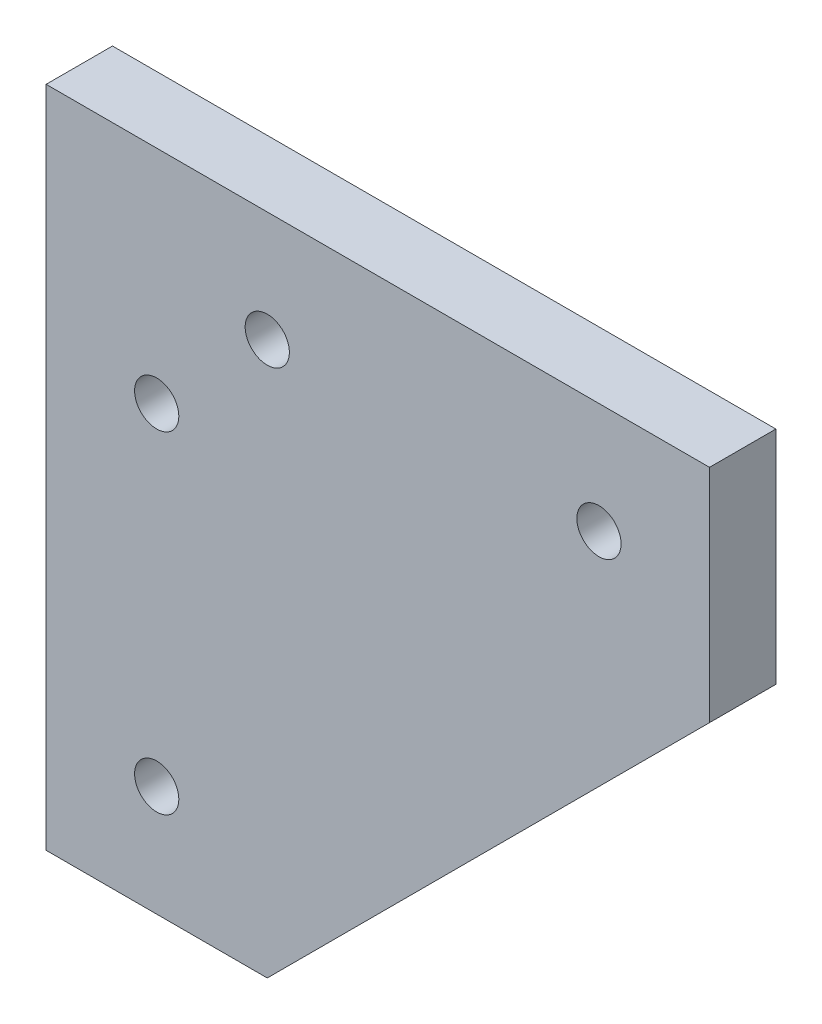
ISO-10303-21;
HEADER;
FILE_DESCRIPTION(('STEP AP214'),'2;1');
FILE_NAME('part.step','',(''),(''),'','','');
FILE_SCHEMA(('AUTOMOTIVE_DESIGN { 1 0 10303 214 1 1 1 1 }'));
ENDSEC;
DATA;
#1=APPLICATION_CONTEXT('core data for automotive mechanical design processes');
#2=APPLICATION_PROTOCOL_DEFINITION('international standard','automotive_design',2000,#1);
#3=PRODUCT_CONTEXT('',#1,'mechanical');
#4=PRODUCT('Part','Part','',(#3));
#5=PRODUCT_RELATED_PRODUCT_CATEGORY('part','',(#4));
#6=PRODUCT_DEFINITION_FORMATION('','',#4);
#7=PRODUCT_DEFINITION_CONTEXT('part definition',#1,'design');
#8=PRODUCT_DEFINITION('design','',#6,#7);
#9=PRODUCT_DEFINITION_SHAPE('','',#8);
#10=(LENGTH_UNIT() NAMED_UNIT(*) SI_UNIT(.MILLI.,.METRE.));
#11=(NAMED_UNIT(*) PLANE_ANGLE_UNIT() SI_UNIT($,.RADIAN.));
#12=(NAMED_UNIT(*) SI_UNIT($,.STERADIAN.) SOLID_ANGLE_UNIT());
#13=UNCERTAINTY_MEASURE_WITH_UNIT(LENGTH_MEASURE(1.E-05),#10,'distance_accuracy_value','');
#14=(GEOMETRIC_REPRESENTATION_CONTEXT(3) GLOBAL_UNCERTAINTY_ASSIGNED_CONTEXT((#13)) GLOBAL_UNIT_ASSIGNED_CONTEXT((#10,
#11,#12)) REPRESENTATION_CONTEXT('',''));
#15=CARTESIAN_POINT('',(0.,0.,0.));
#16=DIRECTION('',(0.,0.,1.));
#17=DIRECTION('',(1.,0.,0.));
#18=AXIS2_PLACEMENT_3D('',#15,#16,#17);
#19=CARTESIAN_POINT('',(0.,0.,6.));
#20=DIRECTION('',(0.,0.,1.));
#21=DIRECTION('',(1.,0.,0.));
#22=AXIS2_PLACEMENT_3D('',#19,#20,#21);
#23=PLANE('',#22);
#24=CARTESIAN_POINT('',(10.,-50.,6.));
#25=DIRECTION('',(0.,0.,1.));
#26=DIRECTION('',(1.,0.,0.));
#27=AXIS2_PLACEMENT_3D('',#24,#25,#26);
#28=CIRCLE('',#27,2.);
#29=CARTESIAN_POINT('',(12.,-50.,6.));
#30=VERTEX_POINT('',#29);
#31=EDGE_CURVE('E172',#30,#30,#28,.T.);
#32=ORIENTED_EDGE('',*,*,#31,.F.);
#33=EDGE_LOOP('',(#32));
#34=FACE_BOUND('',#33,.T.);
#35=CARTESIAN_POINT('',(50.,-10.,6.));
#36=DIRECTION('',(0.,0.,1.));
#37=DIRECTION('',(1.,0.,0.));
#38=AXIS2_PLACEMENT_3D('',#35,#36,#37);
#39=CIRCLE('',#38,2.);
#40=CARTESIAN_POINT('',(52.,-10.,6.));
#41=VERTEX_POINT('',#40);
#42=EDGE_CURVE('E112',#41,#41,#39,.T.);
#43=ORIENTED_EDGE('',*,*,#42,.F.);
#44=EDGE_LOOP('',(#43));
#45=FACE_BOUND('',#44,.T.);
#46=DIRECTION('',(0.,-1.,0.));
#47=VECTOR('',#46,1.);
#48=CARTESIAN_POINT('',(0.,0.,6.));
#49=LINE('',#48,#47);
#50=CARTESIAN_POINT('',(0.,0.,6.));
#51=VERTEX_POINT('',#50);
#52=CARTESIAN_POINT('',(0.,-60.,6.));
#53=VERTEX_POINT('',#52);
#54=EDGE_CURVE('E117',#51,#53,#49,.T.);
#55=ORIENTED_EDGE('',*,*,#54,.T.);
#56=DIRECTION('',(1.,0.,0.));
#57=VECTOR('',#56,1.);
#58=CARTESIAN_POINT('',(0.,-60.,6.));
#59=LINE('',#58,#57);
#60=CARTESIAN_POINT('',(20.,-60.,6.));
#61=VERTEX_POINT('',#60);
#62=EDGE_CURVE('E84',#53,#61,#59,.T.);
#63=ORIENTED_EDGE('',*,*,#62,.T.);
#64=DIRECTION('',(0.707106781186548,0.707106781186548,0.));
#65=VECTOR('',#64,1.);
#66=CARTESIAN_POINT('',(20.,-60.,6.));
#67=LINE('',#66,#65);
#68=CARTESIAN_POINT('',(60.,-20.,6.));
#69=VERTEX_POINT('',#68);
#70=EDGE_CURVE('E88',#61,#69,#67,.T.);
#71=ORIENTED_EDGE('',*,*,#70,.T.);
#72=DIRECTION('',(0.,1.,0.));
#73=VECTOR('',#72,1.);
#74=CARTESIAN_POINT('',(60.,0.,6.));
#75=LINE('',#74,#73);
#76=CARTESIAN_POINT('',(60.,0.,6.));
#77=VERTEX_POINT('',#76);
#78=EDGE_CURVE('E92',#69,#77,#75,.T.);
#79=ORIENTED_EDGE('',*,*,#78,.T.);
#80=DIRECTION('',(-1.,0.,0.));
#81=VECTOR('',#80,1.);
#82=CARTESIAN_POINT('',(0.,0.,6.));
#83=LINE('',#82,#81);
#84=EDGE_CURVE('E50',#77,#51,#83,.T.);
#85=ORIENTED_EDGE('',*,*,#84,.T.);
#86=EDGE_LOOP('',(#55,#63,#71,#79,#85));
#87=FACE_BOUND('',#86,.T.);
#88=CARTESIAN_POINT('',(20.,-10.,6.));
#89=DIRECTION('',(0.,0.,1.));
#90=DIRECTION('',(1.,0.,0.));
#91=AXIS2_PLACEMENT_3D('',#88,#89,#90);
#92=CIRCLE('',#91,2.);
#93=CARTESIAN_POINT('',(22.,-10.,6.));
#94=VERTEX_POINT('',#93);
#95=EDGE_CURVE('E178',#94,#94,#92,.T.);
#96=ORIENTED_EDGE('',*,*,#95,.F.);
#97=EDGE_LOOP('',(#96));
#98=FACE_BOUND('',#97,.T.);
#99=CARTESIAN_POINT('',(10.,-20.,6.));
#100=DIRECTION('',(0.,0.,1.));
#101=DIRECTION('',(1.,0.,0.));
#102=AXIS2_PLACEMENT_3D('',#99,#100,#101);
#103=CIRCLE('',#102,2.);
#104=CARTESIAN_POINT('',(12.,-20.,6.));
#105=VERTEX_POINT('',#104);
#106=EDGE_CURVE('E163',#105,#105,#103,.T.);
#107=ORIENTED_EDGE('',*,*,#106,.F.);
#108=EDGE_LOOP('',(#107));
#109=FACE_BOUND('',#108,.T.);
#110=ADVANCED_FACE('F33',(#34,#45,#87,#98,#109),#23,.T.);
#111=CARTESIAN_POINT('',(0.,0.,0.));
#112=DIRECTION('',(0.,0.,1.));
#113=DIRECTION('',(1.,0.,0.));
#114=AXIS2_PLACEMENT_3D('',#111,#112,#113);
#115=PLANE('',#114);
#116=DIRECTION('',(0.,-1.,0.));
#117=VECTOR('',#116,1.);
#118=CARTESIAN_POINT('',(0.,0.,0.));
#119=LINE('',#118,#117);
#120=CARTESIAN_POINT('',(0.,0.,0.));
#121=VERTEX_POINT('',#120);
#122=CARTESIAN_POINT('',(0.,-60.,0.));
#123=VERTEX_POINT('',#122);
#124=EDGE_CURVE('E108',#121,#123,#119,.T.);
#125=ORIENTED_EDGE('',*,*,#124,.F.);
#126=DIRECTION('',(-1.,0.,0.));
#127=VECTOR('',#126,1.);
#128=CARTESIAN_POINT('',(0.,0.,0.));
#129=LINE('',#128,#127);
#130=CARTESIAN_POINT('',(60.,0.,0.));
#131=VERTEX_POINT('',#130);
#132=EDGE_CURVE('E76',#131,#121,#129,.T.);
#133=ORIENTED_EDGE('',*,*,#132,.F.);
#134=DIRECTION('',(0.,1.,0.));
#135=VECTOR('',#134,1.);
#136=CARTESIAN_POINT('',(60.,0.,0.));
#137=LINE('',#136,#135);
#138=CARTESIAN_POINT('',(60.,-20.,0.));
#139=VERTEX_POINT('',#138);
#140=EDGE_CURVE('E70',#139,#131,#137,.T.);
#141=ORIENTED_EDGE('',*,*,#140,.F.);
#142=DIRECTION('',(0.707106781186548,0.707106781186548,0.));
#143=VECTOR('',#142,1.);
#144=CARTESIAN_POINT('',(20.,-60.,0.));
#145=LINE('',#144,#143);
#146=CARTESIAN_POINT('',(20.,-60.,0.));
#147=VERTEX_POINT('',#146);
#148=EDGE_CURVE('E99',#147,#139,#145,.T.);
#149=ORIENTED_EDGE('',*,*,#148,.F.);
#150=DIRECTION('',(1.,0.,0.));
#151=VECTOR('',#150,1.);
#152=CARTESIAN_POINT('',(0.,-60.,0.));
#153=LINE('',#152,#151);
#154=EDGE_CURVE('E111',#123,#147,#153,.T.);
#155=ORIENTED_EDGE('',*,*,#154,.F.);
#156=EDGE_LOOP('',(#125,#133,#141,#149,#155));
#157=FACE_BOUND('',#156,.T.);
#158=CARTESIAN_POINT('',(50.,-10.,0.));
#159=DIRECTION('',(0.,0.,1.));
#160=DIRECTION('',(1.,0.,0.));
#161=AXIS2_PLACEMENT_3D('',#158,#159,#160);
#162=CIRCLE('',#161,2.);
#163=CARTESIAN_POINT('',(52.,-10.,0.));
#164=VERTEX_POINT('',#163);
#165=EDGE_CURVE('E181',#164,#164,#162,.T.);
#166=ORIENTED_EDGE('',*,*,#165,.T.);
#167=EDGE_LOOP('',(#166));
#168=FACE_BOUND('',#167,.T.);
#169=CARTESIAN_POINT('',(20.,-10.,0.));
#170=DIRECTION('',(0.,0.,1.));
#171=DIRECTION('',(1.,0.,0.));
#172=AXIS2_PLACEMENT_3D('',#169,#170,#171);
#173=CIRCLE('',#172,2.);
#174=CARTESIAN_POINT('',(22.,-10.,0.));
#175=VERTEX_POINT('',#174);
#176=EDGE_CURVE('E175',#175,#175,#173,.T.);
#177=ORIENTED_EDGE('',*,*,#176,.T.);
#178=EDGE_LOOP('',(#177));
#179=FACE_BOUND('',#178,.T.);
#180=CARTESIAN_POINT('',(10.,-50.,0.));
#181=DIRECTION('',(0.,0.,1.));
#182=DIRECTION('',(1.,0.,0.));
#183=AXIS2_PLACEMENT_3D('',#180,#181,#182);
#184=CIRCLE('',#183,2.);
#185=CARTESIAN_POINT('',(12.,-50.,0.));
#186=VERTEX_POINT('',#185);
#187=EDGE_CURVE('E169',#186,#186,#184,.T.);
#188=ORIENTED_EDGE('',*,*,#187,.T.);
#189=EDGE_LOOP('',(#188));
#190=FACE_BOUND('',#189,.T.);
#191=CARTESIAN_POINT('',(10.,-20.,0.));
#192=DIRECTION('',(0.,0.,1.));
#193=DIRECTION('',(1.,0.,0.));
#194=AXIS2_PLACEMENT_3D('',#191,#192,#193);
#195=CIRCLE('',#194,2.);
#196=CARTESIAN_POINT('',(12.,-20.,0.));
#197=VERTEX_POINT('',#196);
#198=EDGE_CURVE('E166',#197,#197,#195,.T.);
#199=ORIENTED_EDGE('',*,*,#198,.T.);
#200=EDGE_LOOP('',(#199));
#201=FACE_BOUND('',#200,.T.);
#202=ADVANCED_FACE('F121',(#157,#168,#179,#190,#201),#115,.F.);
#203=CARTESIAN_POINT('',(0.,0.,6.));
#204=DIRECTION('',(1.,0.,0.));
#205=DIRECTION('',(0.,1.,0.));
#206=AXIS2_PLACEMENT_3D('',#203,#204,#205);
#207=PLANE('',#206);
#208=ORIENTED_EDGE('',*,*,#124,.T.);
#209=DIRECTION('',(0.,0.,-1.));
#210=VECTOR('',#209,1.);
#211=CARTESIAN_POINT('',(0.,-60.,6.));
#212=LINE('',#211,#210);
#213=EDGE_CURVE('E11',#53,#123,#212,.T.);
#214=ORIENTED_EDGE('',*,*,#213,.F.);
#215=ORIENTED_EDGE('',*,*,#54,.F.);
#216=DIRECTION('',(0.,0.,-1.));
#217=VECTOR('',#216,1.);
#218=CARTESIAN_POINT('',(0.,0.,6.));
#219=LINE('',#218,#217);
#220=EDGE_CURVE('E104',#51,#121,#219,.T.);
#221=ORIENTED_EDGE('',*,*,#220,.T.);
#222=EDGE_LOOP('',(#208,#214,#215,#221));
#223=FACE_BOUND('',#222,.T.);
#224=ADVANCED_FACE('F35',(#223),#207,.F.);
#225=CARTESIAN_POINT('',(0.,-60.,6.));
#226=DIRECTION('',(0.,1.,0.));
#227=DIRECTION('',(0.,0.,1.));
#228=AXIS2_PLACEMENT_3D('',#225,#226,#227);
#229=PLANE('',#228);
#230=ORIENTED_EDGE('',*,*,#154,.T.);
#231=DIRECTION('',(0.,0.,-1.));
#232=VECTOR('',#231,1.);
#233=CARTESIAN_POINT('',(20.,-60.,6.));
#234=LINE('',#233,#232);
#235=EDGE_CURVE('E42',#61,#147,#234,.T.);
#236=ORIENTED_EDGE('',*,*,#235,.F.);
#237=ORIENTED_EDGE('',*,*,#62,.F.);
#238=ORIENTED_EDGE('',*,*,#213,.T.);
#239=EDGE_LOOP('',(#230,#236,#237,#238));
#240=FACE_BOUND('',#239,.T.);
#241=ADVANCED_FACE('F230',(#240),#229,.F.);
#242=CARTESIAN_POINT('',(20.,-60.,6.));
#243=DIRECTION('',(-0.707106781186547,0.707106781186547,0.));
#244=DIRECTION('',(-0.707106781186548,-0.707106781186548,0.));
#245=AXIS2_PLACEMENT_3D('',#242,#243,#244);
#246=PLANE('',#245);
#247=ORIENTED_EDGE('',*,*,#148,.T.);
#248=DIRECTION('',(0.,0.,-1.));
#249=VECTOR('',#248,1.);
#250=CARTESIAN_POINT('',(60.,-20.,6.));
#251=LINE('',#250,#249);
#252=EDGE_CURVE('E96',#69,#139,#251,.T.);
#253=ORIENTED_EDGE('',*,*,#252,.F.);
#254=ORIENTED_EDGE('',*,*,#70,.F.);
#255=ORIENTED_EDGE('',*,*,#235,.T.);
#256=EDGE_LOOP('',(#247,#253,#254,#255));
#257=FACE_BOUND('',#256,.T.);
#258=ADVANCED_FACE('F97',(#257),#246,.F.);
#259=CARTESIAN_POINT('',(60.,0.,6.));
#260=DIRECTION('',(-1.,0.,0.));
#261=DIRECTION('',(0.,0.,1.));
#262=AXIS2_PLACEMENT_3D('',#259,#260,#261);
#263=PLANE('',#262);
#264=ORIENTED_EDGE('',*,*,#140,.T.);
#265=DIRECTION('',(0.,0.,-1.));
#266=VECTOR('',#265,1.);
#267=CARTESIAN_POINT('',(60.,0.,6.));
#268=LINE('',#267,#266);
#269=EDGE_CURVE('E100',#77,#131,#268,.T.);
#270=ORIENTED_EDGE('',*,*,#269,.F.);
#271=ORIENTED_EDGE('',*,*,#78,.F.);
#272=ORIENTED_EDGE('',*,*,#252,.T.);
#273=EDGE_LOOP('',(#264,#270,#271,#272));
#274=FACE_BOUND('',#273,.T.);
#275=ADVANCED_FACE('F102',(#274),#263,.F.);
#276=CARTESIAN_POINT('',(0.,0.,6.));
#277=DIRECTION('',(0.,-1.,0.));
#278=DIRECTION('',(0.,0.,-1.));
#279=AXIS2_PLACEMENT_3D('',#276,#277,#278);
#280=PLANE('',#279);
#281=ORIENTED_EDGE('',*,*,#132,.T.);
#282=ORIENTED_EDGE('',*,*,#220,.F.);
#283=ORIENTED_EDGE('',*,*,#84,.F.);
#284=ORIENTED_EDGE('',*,*,#269,.T.);
#285=EDGE_LOOP('',(#281,#282,#283,#284));
#286=FACE_BOUND('',#285,.T.);
#287=ADVANCED_FACE('F126',(#286),#280,.F.);
#288=CARTESIAN_POINT('',(50.,-10.,6.));
#289=DIRECTION('',(0.,0.,-1.));
#290=DIRECTION('',(-1.,0.,0.));
#291=AXIS2_PLACEMENT_3D('',#288,#289,#290);
#292=CYLINDRICAL_SURFACE('',#291,2.);
#293=ORIENTED_EDGE('',*,*,#42,.T.);
#294=EDGE_LOOP('',(#293));
#295=FACE_BOUND('',#294,.T.);
#296=ORIENTED_EDGE('',*,*,#165,.F.);
#297=EDGE_LOOP('',(#296));
#298=FACE_BOUND('',#297,.T.);
#299=ADVANCED_FACE('F128',(#295,#298),#292,.F.);
#300=CARTESIAN_POINT('',(20.,-10.,6.));
#301=DIRECTION('',(0.,0.,-1.));
#302=DIRECTION('',(-1.,0.,0.));
#303=AXIS2_PLACEMENT_3D('',#300,#301,#302);
#304=CYLINDRICAL_SURFACE('',#303,2.);
#305=ORIENTED_EDGE('',*,*,#95,.T.);
#306=EDGE_LOOP('',(#305));
#307=FACE_BOUND('',#306,.T.);
#308=ORIENTED_EDGE('',*,*,#176,.F.);
#309=EDGE_LOOP('',(#308));
#310=FACE_BOUND('',#309,.T.);
#311=ADVANCED_FACE('F134',(#307,#310),#304,.F.);
#312=CARTESIAN_POINT('',(10.,-50.,6.));
#313=DIRECTION('',(0.,0.,-1.));
#314=DIRECTION('',(-1.,0.,0.));
#315=AXIS2_PLACEMENT_3D('',#312,#313,#314);
#316=CYLINDRICAL_SURFACE('',#315,2.);
#317=ORIENTED_EDGE('',*,*,#31,.T.);
#318=EDGE_LOOP('',(#317));
#319=FACE_BOUND('',#318,.T.);
#320=ORIENTED_EDGE('',*,*,#187,.F.);
#321=EDGE_LOOP('',(#320));
#322=FACE_BOUND('',#321,.T.);
#323=ADVANCED_FACE('F150',(#319,#322),#316,.F.);
#324=CARTESIAN_POINT('',(10.,-20.,6.));
#325=DIRECTION('',(0.,0.,-1.));
#326=DIRECTION('',(-1.,0.,0.));
#327=AXIS2_PLACEMENT_3D('',#324,#325,#326);
#328=CYLINDRICAL_SURFACE('',#327,2.);
#329=ORIENTED_EDGE('',*,*,#106,.T.);
#330=EDGE_LOOP('',(#329));
#331=FACE_BOUND('',#330,.T.);
#332=ORIENTED_EDGE('',*,*,#198,.F.);
#333=EDGE_LOOP('',(#332));
#334=FACE_BOUND('',#333,.T.);
#335=ADVANCED_FACE('F154',(#331,#334),#328,.F.);
#336=CLOSED_SHELL('',(#110,#202,#224,#241,#258,#275,#287,#299,#311,#323,#335));
#337=MANIFOLD_SOLID_BREP('B2',#336);
#338=ADVANCED_BREP_SHAPE_REPRESENTATION('',(#18,#337),#14);
#339=SHAPE_DEFINITION_REPRESENTATION(#9,#338);
ENDSEC;
END-ISO-10303-21;
